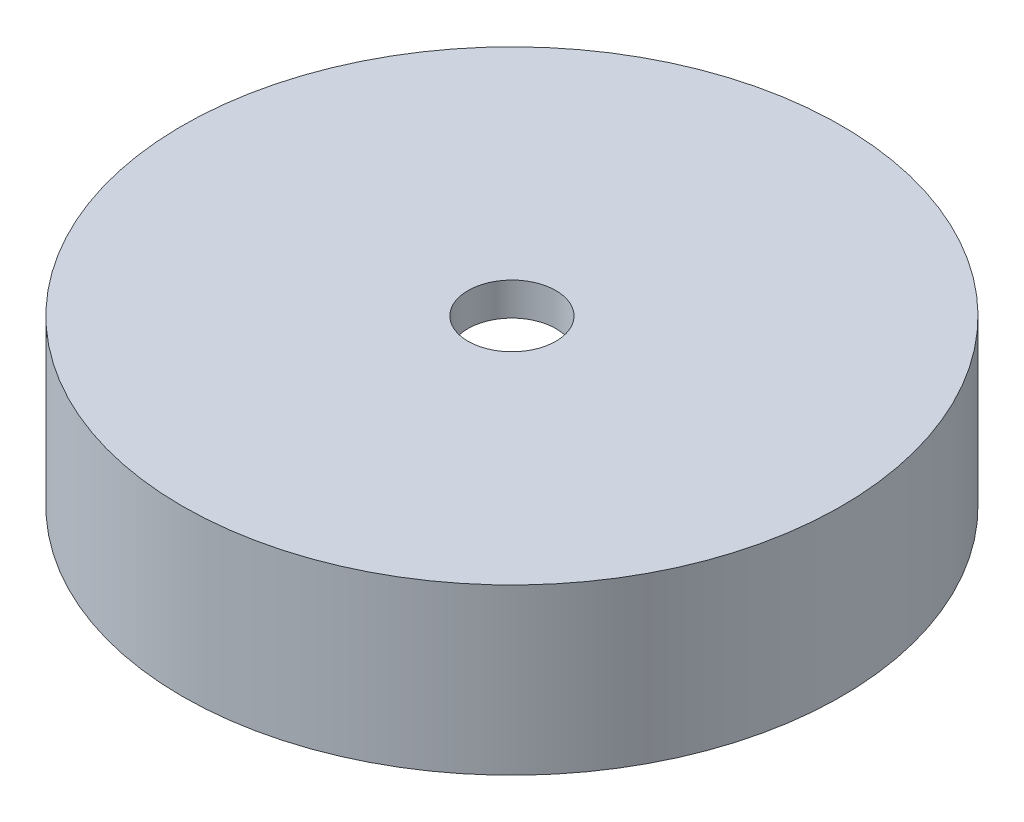
ISO-10303-21;
HEADER;
FILE_DESCRIPTION(('STEP AP214'),'2;1');
FILE_NAME('part.step','',(''),(''),'','','');
FILE_SCHEMA(('AUTOMOTIVE_DESIGN { 1 0 10303 214 1 1 1 1 }'));
ENDSEC;
DATA;
#1=APPLICATION_CONTEXT('core data for automotive mechanical design processes');
#2=APPLICATION_PROTOCOL_DEFINITION('international standard','automotive_design',2000,#1);
#3=PRODUCT_CONTEXT('',#1,'mechanical');
#4=PRODUCT('Part','Part','',(#3));
#5=PRODUCT_RELATED_PRODUCT_CATEGORY('part','',(#4));
#6=PRODUCT_DEFINITION_FORMATION('','',#4);
#7=PRODUCT_DEFINITION_CONTEXT('part definition',#1,'design');
#8=PRODUCT_DEFINITION('design','',#6,#7);
#9=PRODUCT_DEFINITION_SHAPE('','',#8);
#10=(LENGTH_UNIT() NAMED_UNIT(*) SI_UNIT(.MILLI.,.METRE.));
#11=(NAMED_UNIT(*) PLANE_ANGLE_UNIT() SI_UNIT($,.RADIAN.));
#12=(NAMED_UNIT(*) SI_UNIT($,.STERADIAN.) SOLID_ANGLE_UNIT());
#13=UNCERTAINTY_MEASURE_WITH_UNIT(LENGTH_MEASURE(1.E-05),#10,'distance_accuracy_value','');
#14=(GEOMETRIC_REPRESENTATION_CONTEXT(3) GLOBAL_UNCERTAINTY_ASSIGNED_CONTEXT((#13)) GLOBAL_UNIT_ASSIGNED_CONTEXT((#10,
#11,#12)) REPRESENTATION_CONTEXT('',''));
#15=CARTESIAN_POINT('',(0.,0.,0.));
#16=DIRECTION('',(0.,0.,1.));
#17=DIRECTION('',(1.,0.,0.));
#18=AXIS2_PLACEMENT_3D('',#15,#16,#17);
#19=CARTESIAN_POINT('',(0.,15.,0.));
#20=DIRECTION('',(0.,-1.,0.));
#21=DIRECTION('',(0.,0.,-1.));
#22=AXIS2_PLACEMENT_3D('',#19,#20,#21);
#23=CYLINDRICAL_SURFACE('',#22,30.);
#24=CARTESIAN_POINT('',(0.,15.,0.));
#25=DIRECTION('',(0.,1.,0.));
#26=DIRECTION('',(0.,0.,1.));
#27=AXIS2_PLACEMENT_3D('',#24,#25,#26);
#28=CIRCLE('',#27,30.);
#29=CARTESIAN_POINT('',(0.,15.,30.));
#30=VERTEX_POINT('',#29);
#31=EDGE_CURVE('E10',#30,#30,#28,.T.);
#32=ORIENTED_EDGE('',*,*,#31,.F.);
#33=EDGE_LOOP('',(#32));
#34=FACE_BOUND('',#33,.T.);
#35=CARTESIAN_POINT('',(0.,0.,0.));
#36=DIRECTION('',(0.,1.,0.));
#37=DIRECTION('',(0.,0.,1.));
#38=AXIS2_PLACEMENT_3D('',#35,#36,#37);
#39=CIRCLE('',#38,30.);
#40=CARTESIAN_POINT('',(0.,0.,30.));
#41=VERTEX_POINT('',#40);
#42=EDGE_CURVE('E58',#41,#41,#39,.T.);
#43=ORIENTED_EDGE('',*,*,#42,.T.);
#44=EDGE_LOOP('',(#43));
#45=FACE_BOUND('',#44,.T.);
#46=ADVANCED_FACE('F49',(#34,#45),#23,.T.);
#47=CARTESIAN_POINT('',(0.,15.,0.));
#48=DIRECTION('',(0.,1.,0.));
#49=DIRECTION('',(0.,0.,1.));
#50=AXIS2_PLACEMENT_3D('',#47,#48,#49);
#51=PLANE('',#50);
#52=CARTESIAN_POINT('',(0.,15.,0.));
#53=DIRECTION('',(0.,1.,0.));
#54=DIRECTION('',(0.,0.,1.));
#55=AXIS2_PLACEMENT_3D('',#52,#53,#54);
#56=CIRCLE('',#55,4.);
#57=CARTESIAN_POINT('',(0.,15.,4.));
#58=VERTEX_POINT('',#57);
#59=EDGE_CURVE('E71',#58,#58,#56,.T.);
#60=ORIENTED_EDGE('',*,*,#59,.F.);
#61=EDGE_LOOP('',(#60));
#62=FACE_BOUND('',#61,.T.);
#63=ORIENTED_EDGE('',*,*,#31,.T.);
#64=EDGE_LOOP('',(#63));
#65=FACE_BOUND('',#64,.T.);
#66=ADVANCED_FACE('F94',(#62,#65),#51,.T.);
#67=CARTESIAN_POINT('',(0.,0.,0.));
#68=DIRECTION('',(0.,1.,0.));
#69=DIRECTION('',(0.,0.,1.));
#70=AXIS2_PLACEMENT_3D('',#67,#68,#69);
#71=PLANE('',#70);
#72=CARTESIAN_POINT('',(0.,0.,0.));
#73=DIRECTION('',(0.,1.,0.));
#74=DIRECTION('',(0.,0.,1.));
#75=AXIS2_PLACEMENT_3D('',#72,#73,#74);
#76=CIRCLE('',#75,25.);
#77=CARTESIAN_POINT('',(0.,0.,25.));
#78=VERTEX_POINT('',#77);
#79=EDGE_CURVE('E67',#78,#78,#76,.T.);
#80=ORIENTED_EDGE('',*,*,#79,.T.);
#81=EDGE_LOOP('',(#80));
#82=FACE_BOUND('',#81,.T.);
#83=ORIENTED_EDGE('',*,*,#42,.F.);
#84=EDGE_LOOP('',(#83));
#85=FACE_BOUND('',#84,.T.);
#86=ADVANCED_FACE('F98',(#82,#85),#71,.F.);
#87=CARTESIAN_POINT('',(0.,12.,0.));
#88=DIRECTION('',(0.,-1.,0.));
#89=DIRECTION('',(0.,0.,-1.));
#90=AXIS2_PLACEMENT_3D('',#87,#88,#89);
#91=CYLINDRICAL_SURFACE('',#90,25.);
#92=CARTESIAN_POINT('',(0.,12.,0.));
#93=DIRECTION('',(0.,1.,0.));
#94=DIRECTION('',(0.,0.,1.));
#95=AXIS2_PLACEMENT_3D('',#92,#93,#94);
#96=CIRCLE('',#95,25.);
#97=CARTESIAN_POINT('',(0.,12.,25.));
#98=VERTEX_POINT('',#97);
#99=EDGE_CURVE('E65',#98,#98,#96,.T.);
#100=ORIENTED_EDGE('',*,*,#99,.T.);
#101=EDGE_LOOP('',(#100));
#102=FACE_BOUND('',#101,.T.);
#103=ORIENTED_EDGE('',*,*,#79,.F.);
#104=EDGE_LOOP('',(#103));
#105=FACE_BOUND('',#104,.T.);
#106=ADVANCED_FACE('F90',(#102,#105),#91,.F.);
#107=CARTESIAN_POINT('',(0.,12.,0.));
#108=DIRECTION('',(0.,1.,0.));
#109=DIRECTION('',(0.,0.,1.));
#110=AXIS2_PLACEMENT_3D('',#107,#108,#109);
#111=PLANE('',#110);
#112=CARTESIAN_POINT('',(0.,12.,0.));
#113=DIRECTION('',(0.,1.,0.));
#114=DIRECTION('',(0.,0.,1.));
#115=AXIS2_PLACEMENT_3D('',#112,#113,#114);
#116=CIRCLE('',#115,4.);
#117=CARTESIAN_POINT('',(0.,12.,4.));
#118=VERTEX_POINT('',#117);
#119=EDGE_CURVE('E53',#118,#118,#116,.T.);
#120=ORIENTED_EDGE('',*,*,#119,.T.);
#121=EDGE_LOOP('',(#120));
#122=FACE_BOUND('',#121,.T.);
#123=ORIENTED_EDGE('',*,*,#99,.F.);
#124=EDGE_LOOP('',(#123));
#125=FACE_BOUND('',#124,.T.);
#126=ADVANCED_FACE('F82',(#122,#125),#111,.F.);
#127=CARTESIAN_POINT('',(0.,-46.,0.));
#128=DIRECTION('',(0.,1.,0.));
#129=DIRECTION('',(0.,0.,1.));
#130=AXIS2_PLACEMENT_3D('',#127,#128,#129);
#131=CYLINDRICAL_SURFACE('',#130,4.);
#132=CARTESIAN_POINT('',(0.,15.,4.));
#133=CARTESIAN_POINT('',(0.,14.96875,4.));
#134=CARTESIAN_POINT('',(0.,14.9375,4.));
#135=CARTESIAN_POINT('',(0.,14.875,4.));
#136=CARTESIAN_POINT('',(0.,14.84375,4.));
#137=CARTESIAN_POINT('',(0.,14.78125,4.));
#138=CARTESIAN_POINT('',(0.,14.75,4.));
#139=CARTESIAN_POINT('',(0.,14.6875,4.));
#140=CARTESIAN_POINT('',(0.,14.65625,4.));
#141=CARTESIAN_POINT('',(0.,14.59375,4.));
#142=CARTESIAN_POINT('',(0.,14.5625,4.));
#143=CARTESIAN_POINT('',(0.,14.5,4.));
#144=CARTESIAN_POINT('',(0.,14.46875,4.));
#145=CARTESIAN_POINT('',(0.,14.40625,4.));
#146=CARTESIAN_POINT('',(0.,14.375,4.));
#147=CARTESIAN_POINT('',(0.,14.3125,4.));
#148=CARTESIAN_POINT('',(0.,14.28125,4.));
#149=CARTESIAN_POINT('',(0.,14.21875,4.));
#150=CARTESIAN_POINT('',(0.,14.1875,4.));
#151=CARTESIAN_POINT('',(0.,14.125,4.));
#152=CARTESIAN_POINT('',(0.,14.09375,4.));
#153=CARTESIAN_POINT('',(0.,14.03125,4.));
#154=CARTESIAN_POINT('',(0.,14.,4.));
#155=CARTESIAN_POINT('',(0.,13.9375,4.));
#156=CARTESIAN_POINT('',(0.,13.90625,4.));
#157=CARTESIAN_POINT('',(0.,13.84375,4.));
#158=CARTESIAN_POINT('',(0.,13.8125,4.));
#159=CARTESIAN_POINT('',(0.,13.75,4.));
#160=CARTESIAN_POINT('',(0.,13.71875,4.));
#161=CARTESIAN_POINT('',(0.,13.65625,4.));
#162=CARTESIAN_POINT('',(0.,13.625,4.));
#163=CARTESIAN_POINT('',(0.,13.5625,4.));
#164=CARTESIAN_POINT('',(0.,13.53125,4.));
#165=CARTESIAN_POINT('',(0.,13.46875,4.));
#166=CARTESIAN_POINT('',(0.,13.4375,4.));
#167=CARTESIAN_POINT('',(0.,13.375,4.));
#168=CARTESIAN_POINT('',(0.,13.34375,4.));
#169=CARTESIAN_POINT('',(0.,13.28125,4.));
#170=CARTESIAN_POINT('',(0.,13.25,4.));
#171=CARTESIAN_POINT('',(0.,13.1875,4.));
#172=CARTESIAN_POINT('',(0.,13.15625,4.));
#173=CARTESIAN_POINT('',(0.,13.09375,4.));
#174=CARTESIAN_POINT('',(0.,13.0625,4.));
#175=CARTESIAN_POINT('',(0.,13.,4.));
#176=CARTESIAN_POINT('',(0.,12.96875,4.));
#177=CARTESIAN_POINT('',(0.,12.90625,4.));
#178=CARTESIAN_POINT('',(0.,12.875,4.));
#179=CARTESIAN_POINT('',(0.,12.8125,4.));
#180=CARTESIAN_POINT('',(0.,12.78125,4.));
#181=CARTESIAN_POINT('',(0.,12.71875,4.));
#182=CARTESIAN_POINT('',(0.,12.6875,4.));
#183=CARTESIAN_POINT('',(0.,12.625,4.));
#184=CARTESIAN_POINT('',(0.,12.59375,4.));
#185=CARTESIAN_POINT('',(0.,12.53125,4.));
#186=CARTESIAN_POINT('',(0.,12.5,4.));
#187=CARTESIAN_POINT('',(0.,12.4375,4.));
#188=CARTESIAN_POINT('',(0.,12.40625,4.));
#189=CARTESIAN_POINT('',(0.,12.34375,4.));
#190=CARTESIAN_POINT('',(0.,12.3125,4.));
#191=CARTESIAN_POINT('',(0.,12.25,4.));
#192=CARTESIAN_POINT('',(0.,12.21875,4.));
#193=CARTESIAN_POINT('',(0.,12.15625,4.));
#194=CARTESIAN_POINT('',(0.,12.125,4.));
#195=CARTESIAN_POINT('',(0.,12.0625,4.));
#196=CARTESIAN_POINT('',(0.,12.03125,4.));
#197=CARTESIAN_POINT('',(0.,12.,4.));
#198=B_SPLINE_CURVE_WITH_KNOTS('',3,(#132,#133,#134,#135,#136,#137,#138,#139,#140,#141,#142,
#143,#144,#145,#146,#147,#148,#149,#150,#151,#152,#153,#154,#155,#156,#157,#158,#159,#160,#161,
#162,#163,#164,#165,#166,#167,#168,#169,#170,#171,#172,#173,#174,#175,#176,#177,#178,#179,#180,
#181,#182,#183,#184,#185,#186,#187,#188,#189,#190,#191,#192,#193,#194,#195,#196,#197),
.UNSPECIFIED.,.F.,.F.,(4,2,2,2,2,2,2,2,2,2,2,2,2,2,2,2,2,2,2,2,2,2,2,2,2,2,2,2,2,2,2,2,4),(0.,
0.0937500000000036,0.1875,0.281249999999997,0.375,0.468750000000004,0.5625,0.656249999999997,
0.750000000000001,0.843750000000004,0.937500000000001,1.03125,1.125,1.21875,1.3125,1.40625,1.5,
1.59375,1.6875,1.78125,1.875,1.96875000000001,2.0625,2.15625,2.25,2.34375000000001,2.4375,
2.53125,2.625,2.71875000000001,2.8125,2.90625,3.),.UNSPECIFIED.);
#199=EDGE_CURVE('BSEAM85',#58,#118,#198,.T.);
#200=ORIENTED_EDGE('',*,*,#59,.T.);
#201=ORIENTED_EDGE('',*,*,#119,.F.);
#202=ORIENTED_EDGE('',*,*,#199,.T.);
#203=ORIENTED_EDGE('',*,*,#199,.F.);
#204=EDGE_LOOP('',(#200,#202,#201,#203));
#205=FACE_BOUND('',#204,.T.);
#206=ADVANCED_FACE('F85',(#205),#131,.F.);
#207=CLOSED_SHELL('',(#46,#66,#86,#106,#126,#206));
#208=MANIFOLD_SOLID_BREP('B2',#207);
#209=ADVANCED_BREP_SHAPE_REPRESENTATION('',(#18,#208),#14);
#210=SHAPE_DEFINITION_REPRESENTATION(#9,#209);
ENDSEC;
END-ISO-10303-21;
